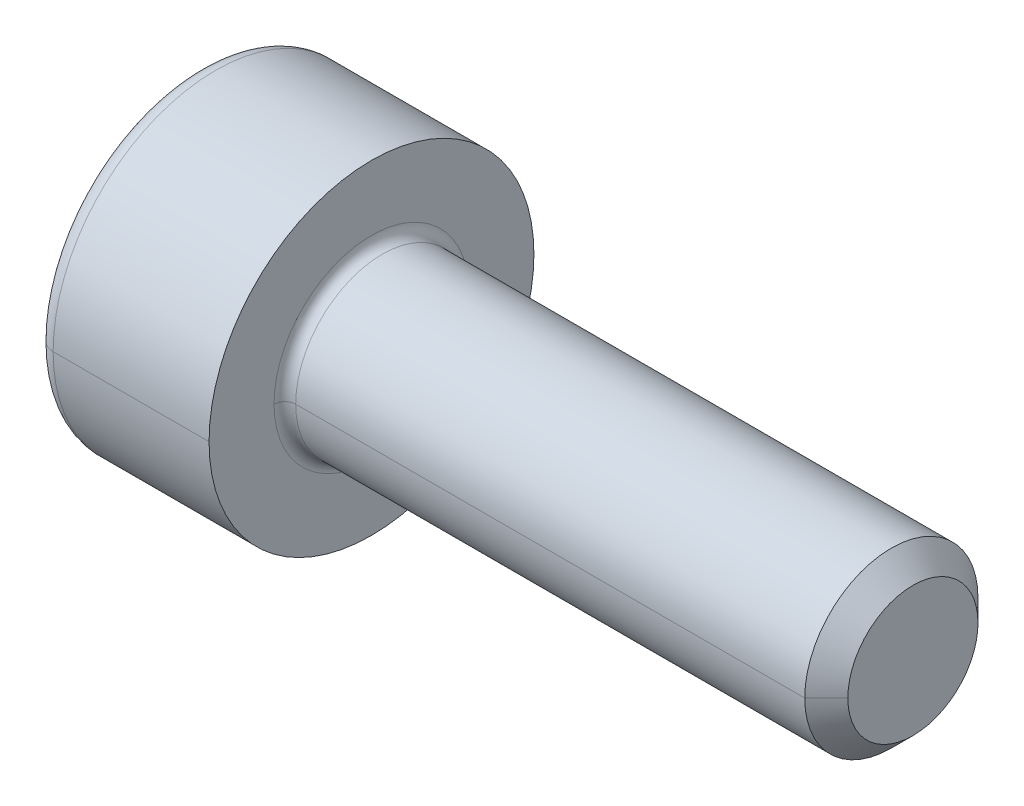
ISO-10303-21;
HEADER;
FILE_DESCRIPTION(('STEP AP214'),'2;1');
FILE_NAME('part.step','',(''),(''),'','','');
FILE_SCHEMA(('AUTOMOTIVE_DESIGN { 1 0 10303 214 1 1 1 1 }'));
ENDSEC;
DATA;
#1=APPLICATION_CONTEXT('core data for automotive mechanical design processes');
#2=APPLICATION_PROTOCOL_DEFINITION('international standard','automotive_design',2000,#1);
#3=PRODUCT_CONTEXT('',#1,'mechanical');
#4=PRODUCT('Part','Part','',(#3));
#5=PRODUCT_RELATED_PRODUCT_CATEGORY('part','',(#4));
#6=PRODUCT_DEFINITION_FORMATION('','',#4);
#7=PRODUCT_DEFINITION_CONTEXT('part definition',#1,'design');
#8=PRODUCT_DEFINITION('design','',#6,#7);
#9=PRODUCT_DEFINITION_SHAPE('','',#8);
#10=(LENGTH_UNIT() NAMED_UNIT(*) SI_UNIT(.MILLI.,.METRE.));
#11=(NAMED_UNIT(*) PLANE_ANGLE_UNIT() SI_UNIT($,.RADIAN.));
#12=(NAMED_UNIT(*) SI_UNIT($,.STERADIAN.) SOLID_ANGLE_UNIT());
#13=UNCERTAINTY_MEASURE_WITH_UNIT(LENGTH_MEASURE(1.E-05),#10,'distance_accuracy_value','');
#14=(GEOMETRIC_REPRESENTATION_CONTEXT(3) GLOBAL_UNCERTAINTY_ASSIGNED_CONTEXT((#13)) GLOBAL_UNIT_ASSIGNED_CONTEXT((#10,
#11,#12)) REPRESENTATION_CONTEXT('',''));
#15=CARTESIAN_POINT('',(0.,0.,0.));
#16=DIRECTION('',(0.,0.,1.));
#17=DIRECTION('',(1.,0.,0.));
#18=AXIS2_PLACEMENT_3D('',#15,#16,#17);
#19=CARTESIAN_POINT('',(0.7,0.,0.));
#20=DIRECTION('',(-1.,0.,0.));
#21=DIRECTION('',(0.,0.,1.));
#22=AXIS2_PLACEMENT_3D('',#19,#20,#21);
#23=CONICAL_SURFACE('',#22,0.76,1.0471975511966);
#24=DIRECTION('',(-0.5,0.,-0.866025403784438));
#25=VECTOR('',#24,1.);
#26=CARTESIAN_POINT('',(0.7,0.,-0.76));
#27=LINE('',#26,#25);
#28=CARTESIAN_POINT('',(1.13878620458412,0.,0.));
#29=VERTEX_POINT('',#28);
#30=CARTESIAN_POINT('',(0.7,0.,-0.76));
#31=VERTEX_POINT('',#30);
#32=EDGE_CURVE('E490',#29,#31,#27,.T.);
#33=ORIENTED_EDGE('',*,*,#32,.F.);
#34=DIRECTION('',(-0.5,0.,0.866025403784438));
#35=VECTOR('',#34,1.);
#36=CARTESIAN_POINT('',(0.7,0.,0.76));
#37=LINE('',#36,#35);
#38=CARTESIAN_POINT('',(0.7,0.,0.76));
#39=VERTEX_POINT('',#38);
#40=EDGE_CURVE('E494',#29,#39,#37,.T.);
#41=ORIENTED_EDGE('',*,*,#40,.T.);
#42=CARTESIAN_POINT('',(0.7,0.,0.));
#43=DIRECTION('',(-1.,0.,0.));
#44=DIRECTION('',(0.,0.,1.));
#45=AXIS2_PLACEMENT_3D('',#42,#43,#44);
#46=CIRCLE('',#45,0.76);
#47=CARTESIAN_POINT('',(0.7,0.658179306876174,0.38));
#48=VERTEX_POINT('',#47);
#49=EDGE_CURVE('E215',#39,#48,#46,.T.);
#50=ORIENTED_EDGE('',*,*,#49,.T.);
#51=CARTESIAN_POINT('',(0.7,0.,0.));
#52=DIRECTION('',(-1.,0.,0.));
#53=DIRECTION('',(0.,0.,1.));
#54=AXIS2_PLACEMENT_3D('',#51,#52,#53);
#55=CIRCLE('',#54,0.76);
#56=CARTESIAN_POINT('',(0.7,0.658179306876173,-0.38));
#57=VERTEX_POINT('',#56);
#58=EDGE_CURVE('E25',#48,#57,#55,.T.);
#59=ORIENTED_EDGE('',*,*,#58,.T.);
#60=CARTESIAN_POINT('',(0.7,0.,0.));
#61=DIRECTION('',(-1.,0.,0.));
#62=DIRECTION('',(0.,0.,1.));
#63=AXIS2_PLACEMENT_3D('',#60,#61,#62);
#64=CIRCLE('',#63,0.76);
#65=EDGE_CURVE('E10',#57,#31,#64,.T.);
#66=ORIENTED_EDGE('',*,*,#65,.T.);
#67=EDGE_LOOP('',(#33,#41,#50,#59,#66));
#68=FACE_BOUND('',#67,.T.);
#69=ADVANCED_FACE('F16',(#68),#23,.F.);
#70=CARTESIAN_POINT('',(0.7,1.31635861375234,-0.76));
#71=DIRECTION('',(1.,0.,0.));
#72=DIRECTION('',(0.,1.,0.));
#73=AXIS2_PLACEMENT_3D('',#70,#71,#72);
#74=PLANE('',#73);
#75=DIRECTION('',(0.,-0.5,-0.866025403784438));
#76=VECTOR('',#75,1.);
#77=CARTESIAN_POINT('',(0.7,0.877572409168231,0.));
#78=LINE('',#77,#76);
#79=CARTESIAN_POINT('',(0.7,0.438786204584114,-0.76));
#80=VERTEX_POINT('',#79);
#81=EDGE_CURVE('E46',#57,#80,#78,.T.);
#82=ORIENTED_EDGE('',*,*,#81,.T.);
#83=DIRECTION('',(0.,-1.,0.));
#84=VECTOR('',#83,1.);
#85=CARTESIAN_POINT('',(0.7,0.438786204584114,-0.76));
#86=LINE('',#85,#84);
#87=EDGE_CURVE('E208',#80,#31,#86,.T.);
#88=ORIENTED_EDGE('',*,*,#87,.T.);
#89=ORIENTED_EDGE('',*,*,#65,.F.);
#90=EDGE_LOOP('',(#82,#88,#89));
#91=FACE_BOUND('',#90,.T.);
#92=ADVANCED_FACE('F249',(#91),#74,.F.);
#93=CARTESIAN_POINT('',(0.7,1.31635861375234,-0.76));
#94=DIRECTION('',(1.,0.,0.));
#95=DIRECTION('',(0.,1.,0.));
#96=AXIS2_PLACEMENT_3D('',#93,#94,#95);
#97=PLANE('',#96);
#98=DIRECTION('',(0.,-0.5,0.86602540378444));
#99=VECTOR('',#98,1.);
#100=CARTESIAN_POINT('',(0.7,0.877572409168231,0.));
#101=LINE('',#100,#99);
#102=CARTESIAN_POINT('',(0.7,0.877572409168231,0.));
#103=VERTEX_POINT('',#102);
#104=EDGE_CURVE('E230',#103,#48,#101,.T.);
#105=ORIENTED_EDGE('',*,*,#104,.F.);
#106=DIRECTION('',(0.,-0.5,-0.866025403784438));
#107=VECTOR('',#106,1.);
#108=CARTESIAN_POINT('',(0.7,0.877572409168231,0.));
#109=LINE('',#108,#107);
#110=EDGE_CURVE('E214',#103,#57,#109,.T.);
#111=ORIENTED_EDGE('',*,*,#110,.T.);
#112=ORIENTED_EDGE('',*,*,#58,.F.);
#113=EDGE_LOOP('',(#105,#111,#112));
#114=FACE_BOUND('',#113,.T.);
#115=ADVANCED_FACE('F18',(#114),#97,.F.);
#116=CARTESIAN_POINT('',(0.7,1.31635861375234,-0.76));
#117=DIRECTION('',(1.,0.,0.));
#118=DIRECTION('',(0.,1.,0.));
#119=AXIS2_PLACEMENT_3D('',#116,#117,#118);
#120=PLANE('',#119);
#121=DIRECTION('',(0.,1.,0.));
#122=VECTOR('',#121,1.);
#123=CARTESIAN_POINT('',(0.7,-0.438786204584114,0.76));
#124=LINE('',#123,#122);
#125=CARTESIAN_POINT('',(0.7,0.438786204584117,0.76));
#126=VERTEX_POINT('',#125);
#127=EDGE_CURVE('E342',#39,#126,#124,.T.);
#128=ORIENTED_EDGE('',*,*,#127,.T.);
#129=DIRECTION('',(0.,-0.5,0.86602540378444));
#130=VECTOR('',#129,1.);
#131=CARTESIAN_POINT('',(0.7,0.877572409168231,0.));
#132=LINE('',#131,#130);
#133=EDGE_CURVE('E345',#48,#126,#132,.T.);
#134=ORIENTED_EDGE('',*,*,#133,.F.);
#135=ORIENTED_EDGE('',*,*,#49,.F.);
#136=EDGE_LOOP('',(#128,#134,#135));
#137=FACE_BOUND('',#136,.T.);
#138=ADVANCED_FACE('F257',(#137),#120,.F.);
#139=CARTESIAN_POINT('',(0.7,1.31635861375234,-0.76));
#140=DIRECTION('',(1.,0.,0.));
#141=DIRECTION('',(0.,1.,0.));
#142=AXIS2_PLACEMENT_3D('',#139,#140,#141);
#143=PLANE('',#142);
#144=DIRECTION('',(0.,-0.5,-0.866025403784438));
#145=VECTOR('',#144,1.);
#146=CARTESIAN_POINT('',(0.7,-0.438786204584114,0.76));
#147=LINE('',#146,#145);
#148=CARTESIAN_POINT('',(0.7,-0.438786204584114,0.76));
#149=VERTEX_POINT('',#148);
#150=CARTESIAN_POINT('',(0.7,-0.658179306876172,0.38));
#151=VERTEX_POINT('',#150);
#152=EDGE_CURVE('E190',#149,#151,#147,.T.);
#153=ORIENTED_EDGE('',*,*,#152,.F.);
#154=DIRECTION('',(0.,1.,0.));
#155=VECTOR('',#154,1.);
#156=CARTESIAN_POINT('',(0.7,-0.438786204584114,0.76));
#157=LINE('',#156,#155);
#158=EDGE_CURVE('E350',#149,#39,#157,.T.);
#159=ORIENTED_EDGE('',*,*,#158,.T.);
#160=CARTESIAN_POINT('',(0.7,0.,0.));
#161=DIRECTION('',(-1.,0.,0.));
#162=DIRECTION('',(0.,0.,1.));
#163=AXIS2_PLACEMENT_3D('',#160,#161,#162);
#164=CIRCLE('',#163,0.76);
#165=EDGE_CURVE('E500',#151,#39,#164,.T.);
#166=ORIENTED_EDGE('',*,*,#165,.F.);
#167=EDGE_LOOP('',(#153,#159,#166));
#168=FACE_BOUND('',#167,.T.);
#169=ADVANCED_FACE('F334',(#168),#143,.F.);
#170=CARTESIAN_POINT('',(0.7,1.31635861375234,-0.76));
#171=DIRECTION('',(1.,0.,0.));
#172=DIRECTION('',(0.,1.,0.));
#173=AXIS2_PLACEMENT_3D('',#170,#171,#172);
#174=PLANE('',#173);
#175=DIRECTION('',(0.,0.5,-0.86602540378444));
#176=VECTOR('',#175,1.);
#177=CARTESIAN_POINT('',(0.7,-0.87757240916823,0.));
#178=LINE('',#177,#176);
#179=CARTESIAN_POINT('',(0.7,-0.87757240916823,0.));
#180=VERTEX_POINT('',#179);
#181=CARTESIAN_POINT('',(0.7,-0.658179306876174,-0.38));
#182=VERTEX_POINT('',#181);
#183=EDGE_CURVE('E164',#180,#182,#178,.T.);
#184=ORIENTED_EDGE('',*,*,#183,.F.);
#185=DIRECTION('',(0.,-0.5,-0.866025403784438));
#186=VECTOR('',#185,1.);
#187=CARTESIAN_POINT('',(0.7,-0.438786204584114,0.76));
#188=LINE('',#187,#186);
#189=EDGE_CURVE('E168',#151,#180,#188,.T.);
#190=ORIENTED_EDGE('',*,*,#189,.F.);
#191=CARTESIAN_POINT('',(0.7,0.,0.));
#192=DIRECTION('',(-1.,0.,0.));
#193=DIRECTION('',(0.,0.,1.));
#194=AXIS2_PLACEMENT_3D('',#191,#192,#193);
#195=CIRCLE('',#194,0.76);
#196=EDGE_CURVE('E171',#182,#151,#195,.T.);
#197=ORIENTED_EDGE('',*,*,#196,.F.);
#198=EDGE_LOOP('',(#184,#190,#197));
#199=FACE_BOUND('',#198,.T.);
#200=ADVANCED_FACE('F166',(#199),#174,.F.);
#201=CARTESIAN_POINT('',(0.7,1.31635861375234,-0.76));
#202=DIRECTION('',(1.,0.,0.));
#203=DIRECTION('',(0.,1.,0.));
#204=AXIS2_PLACEMENT_3D('',#201,#202,#203);
#205=PLANE('',#204);
#206=DIRECTION('',(0.,-1.,0.));
#207=VECTOR('',#206,1.);
#208=CARTESIAN_POINT('',(0.7,0.438786204584114,-0.76));
#209=LINE('',#208,#207);
#210=CARTESIAN_POINT('',(0.7,-0.438786204584116,-0.76));
#211=VERTEX_POINT('',#210);
#212=EDGE_CURVE('E207',#31,#211,#209,.T.);
#213=ORIENTED_EDGE('',*,*,#212,.T.);
#214=DIRECTION('',(0.,0.5,-0.86602540378444));
#215=VECTOR('',#214,1.);
#216=CARTESIAN_POINT('',(0.7,-0.87757240916823,0.));
#217=LINE('',#216,#215);
#218=EDGE_CURVE('E176',#182,#211,#217,.T.);
#219=ORIENTED_EDGE('',*,*,#218,.F.);
#220=CARTESIAN_POINT('',(0.7,0.,0.));
#221=DIRECTION('',(-1.,0.,0.));
#222=DIRECTION('',(0.,0.,1.));
#223=AXIS2_PLACEMENT_3D('',#220,#221,#222);
#224=CIRCLE('',#223,0.76);
#225=EDGE_CURVE('E493',#31,#182,#224,.T.);
#226=ORIENTED_EDGE('',*,*,#225,.F.);
#227=EDGE_LOOP('',(#213,#219,#226));
#228=FACE_BOUND('',#227,.T.);
#229=ADVANCED_FACE('F328',(#228),#205,.F.);
#230=CARTESIAN_POINT('',(0.7,0.877572409168231,0.));
#231=DIRECTION('',(0.,0.866025403784438,-0.5));
#232=DIRECTION('',(-1.,0.,0.));
#233=AXIS2_PLACEMENT_3D('',#230,#231,#232);
#234=PLANE('',#233);
#235=DIRECTION('',(0.,-0.5,-0.866025403784438));
#236=VECTOR('',#235,1.);
#237=CARTESIAN_POINT('',(0.,0.877572409168231,0.));
#238=LINE('',#237,#236);
#239=CARTESIAN_POINT('',(0.,0.877572409168231,0.));
#240=VERTEX_POINT('',#239);
#241=CARTESIAN_POINT('',(0.,0.438786204584114,-0.76));
#242=VERTEX_POINT('',#241);
#243=EDGE_CURVE('E239',#240,#242,#238,.T.);
#244=ORIENTED_EDGE('',*,*,#243,.T.);
#245=DIRECTION('',(-1.,0.,0.));
#246=VECTOR('',#245,1.);
#247=CARTESIAN_POINT('',(0.7,0.438786204584114,-0.76));
#248=LINE('',#247,#246);
#249=EDGE_CURVE('E211',#80,#242,#248,.T.);
#250=ORIENTED_EDGE('',*,*,#249,.F.);
#251=ORIENTED_EDGE('',*,*,#81,.F.);
#252=ORIENTED_EDGE('',*,*,#110,.F.);
#253=DIRECTION('',(-1.,0.,0.));
#254=VECTOR('',#253,1.);
#255=CARTESIAN_POINT('',(0.7,0.877572409168231,0.));
#256=LINE('',#255,#254);
#257=EDGE_CURVE('E365',#103,#240,#256,.T.);
#258=ORIENTED_EDGE('',*,*,#257,.T.);
#259=EDGE_LOOP('',(#244,#250,#251,#252,#258));
#260=FACE_BOUND('',#259,.T.);
#261=ADVANCED_FACE('F236',(#260),#234,.F.);
#262=CARTESIAN_POINT('',(0.7,0.438786204584114,-0.76));
#263=DIRECTION('',(0.,0.,-1.));
#264=DIRECTION('',(0.,-1.,0.));
#265=AXIS2_PLACEMENT_3D('',#262,#263,#264);
#266=PLANE('',#265);
#267=DIRECTION('',(0.,-1.,0.));
#268=VECTOR('',#267,1.);
#269=CARTESIAN_POINT('',(0.,0.438786204584114,-0.76));
#270=LINE('',#269,#268);
#271=CARTESIAN_POINT('',(0.,-0.438786204584116,-0.76));
#272=VERTEX_POINT('',#271);
#273=EDGE_CURVE('E404',#242,#272,#270,.T.);
#274=ORIENTED_EDGE('',*,*,#273,.T.);
#275=DIRECTION('',(-1.,0.,0.));
#276=VECTOR('',#275,1.);
#277=CARTESIAN_POINT('',(0.7,-0.438786204584116,-0.76));
#278=LINE('',#277,#276);
#279=EDGE_CURVE('E204',#211,#272,#278,.T.);
#280=ORIENTED_EDGE('',*,*,#279,.F.);
#281=ORIENTED_EDGE('',*,*,#212,.F.);
#282=ORIENTED_EDGE('',*,*,#87,.F.);
#283=ORIENTED_EDGE('',*,*,#249,.T.);
#284=EDGE_LOOP('',(#274,#280,#281,#282,#283));
#285=FACE_BOUND('',#284,.T.);
#286=ADVANCED_FACE('F246',(#285),#266,.F.);
#287=CARTESIAN_POINT('',(0.7,-0.87757240916823,0.));
#288=DIRECTION('',(0.,0.86602540378444,0.5));
#289=DIRECTION('',(1.,0.,0.));
#290=AXIS2_PLACEMENT_3D('',#287,#288,#289);
#291=PLANE('',#290);
#292=DIRECTION('',(0.,0.5,-0.86602540378444));
#293=VECTOR('',#292,1.);
#294=CARTESIAN_POINT('',(0.,-0.87757240916823,0.));
#295=LINE('',#294,#293);
#296=CARTESIAN_POINT('',(0.,-0.87757240916823,0.));
#297=VERTEX_POINT('',#296);
#298=EDGE_CURVE('E182',#297,#272,#295,.T.);
#299=ORIENTED_EDGE('',*,*,#298,.F.);
#300=DIRECTION('',(-1.,0.,0.));
#301=VECTOR('',#300,1.);
#302=CARTESIAN_POINT('',(0.7,-0.87757240916823,0.));
#303=LINE('',#302,#301);
#304=EDGE_CURVE('E177',#180,#297,#303,.T.);
#305=ORIENTED_EDGE('',*,*,#304,.F.);
#306=ORIENTED_EDGE('',*,*,#183,.T.);
#307=ORIENTED_EDGE('',*,*,#218,.T.);
#308=ORIENTED_EDGE('',*,*,#279,.T.);
#309=EDGE_LOOP('',(#299,#305,#306,#307,#308));
#310=FACE_BOUND('',#309,.T.);
#311=ADVANCED_FACE('F180',(#310),#291,.T.);
#312=CARTESIAN_POINT('',(0.7,-0.438786204584114,0.76));
#313=DIRECTION('',(0.,0.866025403784438,-0.5));
#314=DIRECTION('',(-1.,0.,0.));
#315=AXIS2_PLACEMENT_3D('',#312,#313,#314);
#316=PLANE('',#315);
#317=DIRECTION('',(0.,-0.5,-0.866025403784438));
#318=VECTOR('',#317,1.);
#319=CARTESIAN_POINT('',(0.,-0.438786204584114,0.76));
#320=LINE('',#319,#318);
#321=CARTESIAN_POINT('',(0.,-0.438786204584114,0.76));
#322=VERTEX_POINT('',#321);
#323=EDGE_CURVE('E380',#322,#297,#320,.T.);
#324=ORIENTED_EDGE('',*,*,#323,.F.);
#325=DIRECTION('',(-1.,0.,0.));
#326=VECTOR('',#325,1.);
#327=CARTESIAN_POINT('',(0.7,-0.438786204584114,0.76));
#328=LINE('',#327,#326);
#329=EDGE_CURVE('E198',#149,#322,#328,.T.);
#330=ORIENTED_EDGE('',*,*,#329,.F.);
#331=ORIENTED_EDGE('',*,*,#152,.T.);
#332=ORIENTED_EDGE('',*,*,#189,.T.);
#333=ORIENTED_EDGE('',*,*,#304,.T.);
#334=EDGE_LOOP('',(#324,#330,#331,#332,#333));
#335=FACE_BOUND('',#334,.T.);
#336=ADVANCED_FACE('F188',(#335),#316,.T.);
#337=CARTESIAN_POINT('',(0.7,-0.438786204584114,0.76));
#338=DIRECTION('',(0.,0.,1.));
#339=DIRECTION('',(0.,-1.,0.));
#340=AXIS2_PLACEMENT_3D('',#337,#338,#339);
#341=PLANE('',#340);
#342=DIRECTION('',(0.,1.,0.));
#343=VECTOR('',#342,1.);
#344=CARTESIAN_POINT('',(0.,-0.438786204584114,0.76));
#345=LINE('',#344,#343);
#346=CARTESIAN_POINT('',(0.,0.438786204584117,0.76));
#347=VERTEX_POINT('',#346);
#348=EDGE_CURVE('E355',#322,#347,#345,.T.);
#349=ORIENTED_EDGE('',*,*,#348,.T.);
#350=DIRECTION('',(-1.,0.,0.));
#351=VECTOR('',#350,1.);
#352=CARTESIAN_POINT('',(0.7,0.438786204584117,0.76));
#353=LINE('',#352,#351);
#354=EDGE_CURVE('E351',#126,#347,#353,.T.);
#355=ORIENTED_EDGE('',*,*,#354,.F.);
#356=ORIENTED_EDGE('',*,*,#127,.F.);
#357=ORIENTED_EDGE('',*,*,#158,.F.);
#358=ORIENTED_EDGE('',*,*,#329,.T.);
#359=EDGE_LOOP('',(#349,#355,#356,#357,#358));
#360=FACE_BOUND('',#359,.T.);
#361=ADVANCED_FACE('F275',(#360),#341,.F.);
#362=CARTESIAN_POINT('',(0.7,0.877572409168231,0.));
#363=DIRECTION('',(0.,-0.86602540378444,-0.5));
#364=DIRECTION('',(0.,0.5,-0.86602540378444));
#365=AXIS2_PLACEMENT_3D('',#362,#363,#364);
#366=PLANE('',#365);
#367=DIRECTION('',(0.,-0.5,0.86602540378444));
#368=VECTOR('',#367,1.);
#369=CARTESIAN_POINT('',(0.,0.877572409168231,0.));
#370=LINE('',#369,#368);
#371=EDGE_CURVE('E384',#240,#347,#370,.T.);
#372=ORIENTED_EDGE('',*,*,#371,.F.);
#373=ORIENTED_EDGE('',*,*,#257,.F.);
#374=ORIENTED_EDGE('',*,*,#104,.T.);
#375=ORIENTED_EDGE('',*,*,#133,.T.);
#376=ORIENTED_EDGE('',*,*,#354,.T.);
#377=EDGE_LOOP('',(#372,#373,#374,#375,#376));
#378=FACE_BOUND('',#377,.T.);
#379=ADVANCED_FACE('F287',(#378),#366,.T.);
#380=CARTESIAN_POINT('',(0.16,0.,0.));
#381=DIRECTION('',(-1.,0.,0.));
#382=DIRECTION('',(0.,0.,1.));
#383=AXIS2_PLACEMENT_3D('',#380,#381,#382);
#384=TOROIDAL_SURFACE('',#383,1.34,0.16);
#385=CARTESIAN_POINT('',(0.16,0.,-1.34));
#386=DIRECTION('',(0.,1.,0.));
#387=DIRECTION('',(0.,0.,1.));
#388=AXIS2_PLACEMENT_3D('',#385,#386,#387);
#389=CIRCLE('',#388,0.16);
#390=CARTESIAN_POINT('',(0.16,0.,-1.5));
#391=VERTEX_POINT('',#390);
#392=CARTESIAN_POINT('',(0.,0.,-1.34));
#393=VERTEX_POINT('',#392);
#394=EDGE_CURVE('E507',#391,#393,#389,.T.);
#395=ORIENTED_EDGE('',*,*,#394,.F.);
#396=CARTESIAN_POINT('',(0.16,0.,0.));
#397=DIRECTION('',(1.,0.,0.));
#398=DIRECTION('',(0.,0.,1.));
#399=AXIS2_PLACEMENT_3D('',#396,#397,#398);
#400=CIRCLE('',#399,1.5);
#401=CARTESIAN_POINT('',(0.16,0.,1.5));
#402=VERTEX_POINT('',#401);
#403=EDGE_CURVE('E414',#402,#391,#400,.T.);
#404=ORIENTED_EDGE('',*,*,#403,.F.);
#405=CARTESIAN_POINT('',(0.16,0.,1.34));
#406=DIRECTION('',(0.,-1.,0.));
#407=DIRECTION('',(0.,0.,-1.));
#408=AXIS2_PLACEMENT_3D('',#405,#406,#407);
#409=CIRCLE('',#408,0.16);
#410=CARTESIAN_POINT('',(0.,0.,1.34));
#411=VERTEX_POINT('',#410);
#412=EDGE_CURVE('E460',#402,#411,#409,.T.);
#413=ORIENTED_EDGE('',*,*,#412,.T.);
#414=CARTESIAN_POINT('',(0.,0.,0.));
#415=DIRECTION('',(-1.,0.,0.));
#416=DIRECTION('',(0.,0.,1.));
#417=AXIS2_PLACEMENT_3D('',#414,#415,#416);
#418=CIRCLE('',#417,1.34);
#419=EDGE_CURVE('E390',#393,#411,#418,.T.);
#420=ORIENTED_EDGE('',*,*,#419,.F.);
#421=EDGE_LOOP('',(#395,#404,#413,#420));
#422=FACE_BOUND('',#421,.T.);
#423=ADVANCED_FACE('F283',(#422),#384,.T.);
#424=CARTESIAN_POINT('',(1.7,0.,0.));
#425=DIRECTION('',(1.,0.,0.));
#426=DIRECTION('',(0.,0.,-1.));
#427=AXIS2_PLACEMENT_3D('',#424,#425,#426);
#428=TOROIDAL_SURFACE('',#427,0.9,0.1);
#429=CARTESIAN_POINT('',(1.7,0.,0.9));
#430=DIRECTION('',(0.,1.,0.));
#431=DIRECTION('',(0.,0.,1.));
#432=AXIS2_PLACEMENT_3D('',#429,#430,#431);
#433=CIRCLE('',#432,0.1);
#434=CARTESIAN_POINT('',(1.7,0.,0.8));
#435=VERTEX_POINT('',#434);
#436=CARTESIAN_POINT('',(1.6,0.,0.9));
#437=VERTEX_POINT('',#436);
#438=EDGE_CURVE('E466',#435,#437,#433,.T.);
#439=ORIENTED_EDGE('',*,*,#438,.F.);
#440=CARTESIAN_POINT('',(1.7,0.,0.));
#441=DIRECTION('',(1.,0.,0.));
#442=DIRECTION('',(0.,0.,-1.));
#443=AXIS2_PLACEMENT_3D('',#440,#441,#442);
#444=CIRCLE('',#443,0.8);
#445=CARTESIAN_POINT('',(1.7,0.,-0.8));
#446=VERTEX_POINT('',#445);
#447=EDGE_CURVE('E439',#446,#435,#444,.T.);
#448=ORIENTED_EDGE('',*,*,#447,.F.);
#449=CARTESIAN_POINT('',(1.7,0.,-0.9));
#450=DIRECTION('',(0.,-1.,0.));
#451=DIRECTION('',(0.,0.,-1.));
#452=AXIS2_PLACEMENT_3D('',#449,#450,#451);
#453=CIRCLE('',#452,0.1);
#454=CARTESIAN_POINT('',(1.6,0.,-0.9));
#455=VERTEX_POINT('',#454);
#456=EDGE_CURVE('E473',#446,#455,#453,.T.);
#457=ORIENTED_EDGE('',*,*,#456,.T.);
#458=CARTESIAN_POINT('',(1.6,0.,0.));
#459=DIRECTION('',(-1.,0.,0.));
#460=DIRECTION('',(0.,0.,-1.));
#461=AXIS2_PLACEMENT_3D('',#458,#459,#460);
#462=CIRCLE('',#461,0.9);
#463=EDGE_CURVE('E416',#437,#455,#462,.T.);
#464=ORIENTED_EDGE('',*,*,#463,.F.);
#465=EDGE_LOOP('',(#439,#448,#457,#464));
#466=FACE_BOUND('',#465,.T.);
#467=ADVANCED_FACE('F286',(#466),#428,.F.);
#468=CARTESIAN_POINT('',(6.6,0.601,0.));
#469=DIRECTION('',(1.,0.,0.));
#470=DIRECTION('',(0.,1.,0.));
#471=AXIS2_PLACEMENT_3D('',#468,#469,#470);
#472=PLANE('',#471);
#473=CARTESIAN_POINT('',(6.6,0.,0.));
#474=DIRECTION('',(-1.,0.,0.));
#475=DIRECTION('',(0.,0.,1.));
#476=AXIS2_PLACEMENT_3D('',#473,#474,#475);
#477=CIRCLE('',#476,0.601);
#478=CARTESIAN_POINT('',(6.6,0.,0.601));
#479=VERTEX_POINT('',#478);
#480=CARTESIAN_POINT('',(6.6,0.,-0.601));
#481=VERTEX_POINT('',#480);
#482=EDGE_CURVE('E455',#479,#481,#477,.T.);
#483=ORIENTED_EDGE('',*,*,#482,.F.);
#484=CARTESIAN_POINT('',(6.6,0.,0.));
#485=DIRECTION('',(-1.,0.,0.));
#486=DIRECTION('',(0.,0.,1.));
#487=AXIS2_PLACEMENT_3D('',#484,#485,#486);
#488=CIRCLE('',#487,0.601);
#489=EDGE_CURVE('E371',#481,#479,#488,.T.);
#490=ORIENTED_EDGE('',*,*,#489,.F.);
#491=EDGE_LOOP('',(#483,#490));
#492=FACE_BOUND('',#491,.T.);
#493=ADVANCED_FACE('F317',(#492),#472,.T.);
#494=CARTESIAN_POINT('',(6.6,0.,0.));
#495=DIRECTION('',(-1.,0.,0.));
#496=DIRECTION('',(0.,0.,1.));
#497=AXIS2_PLACEMENT_3D('',#494,#495,#496);
#498=CONICAL_SURFACE('',#497,0.601,0.785398163397453);
#499=DIRECTION('',(-0.707106781186544,0.,-0.707106781186552));
#500=VECTOR('',#499,1.);
#501=CARTESIAN_POINT('',(6.6,0.,-0.601));
#502=LINE('',#501,#500);
#503=CARTESIAN_POINT('',(6.401,0.,-0.8));
#504=VERTEX_POINT('',#503);
#505=EDGE_CURVE('E449',#481,#504,#502,.T.);
#506=ORIENTED_EDGE('',*,*,#505,.F.);
#507=ORIENTED_EDGE('',*,*,#489,.T.);
#508=DIRECTION('',(-0.707106781186544,0.,0.707106781186552));
#509=VECTOR('',#508,1.);
#510=CARTESIAN_POINT('',(6.6,0.,0.601));
#511=LINE('',#510,#509);
#512=CARTESIAN_POINT('',(6.401,0.,0.8));
#513=VERTEX_POINT('',#512);
#514=EDGE_CURVE('E444',#479,#513,#511,.T.);
#515=ORIENTED_EDGE('',*,*,#514,.T.);
#516=CARTESIAN_POINT('',(6.401,0.,0.));
#517=DIRECTION('',(-1.,0.,0.));
#518=DIRECTION('',(0.,0.,1.));
#519=AXIS2_PLACEMENT_3D('',#516,#517,#518);
#520=CIRCLE('',#519,0.8);
#521=EDGE_CURVE('E369',#504,#513,#520,.T.);
#522=ORIENTED_EDGE('',*,*,#521,.F.);
#523=EDGE_LOOP('',(#506,#507,#515,#522));
#524=FACE_BOUND('',#523,.T.);
#525=ADVANCED_FACE('F313',(#524),#498,.T.);
#526=CARTESIAN_POINT('',(-31.75,0.,0.));
#527=DIRECTION('',(-1.,0.,0.));
#528=DIRECTION('',(0.,0.,1.));
#529=AXIS2_PLACEMENT_3D('',#526,#527,#528);
#530=CYLINDRICAL_SURFACE('',#529,0.8);
#531=DIRECTION('',(-1.,0.,0.));
#532=VECTOR('',#531,1.);
#533=CARTESIAN_POINT('',(-31.75,0.,-0.8));
#534=LINE('',#533,#532);
#535=EDGE_CURVE('E432',#504,#446,#534,.T.);
#536=ORIENTED_EDGE('',*,*,#535,.F.);
#537=ORIENTED_EDGE('',*,*,#521,.T.);
#538=DIRECTION('',(-1.,0.,0.));
#539=VECTOR('',#538,1.);
#540=CARTESIAN_POINT('',(-31.75,0.,0.8));
#541=LINE('',#540,#539);
#542=EDGE_CURVE('E429',#513,#435,#541,.T.);
#543=ORIENTED_EDGE('',*,*,#542,.T.);
#544=CARTESIAN_POINT('',(1.7,0.,0.));
#545=DIRECTION('',(1.,0.,0.));
#546=DIRECTION('',(0.,0.,-1.));
#547=AXIS2_PLACEMENT_3D('',#544,#545,#546);
#548=CIRCLE('',#547,0.8);
#549=EDGE_CURVE('E464',#435,#446,#548,.T.);
#550=ORIENTED_EDGE('',*,*,#549,.T.);
#551=EDGE_LOOP('',(#536,#537,#543,#550));
#552=FACE_BOUND('',#551,.T.);
#553=ADVANCED_FACE('F309',(#552),#530,.T.);
#554=CARTESIAN_POINT('',(1.6,1.5,0.));
#555=DIRECTION('',(1.,0.,0.));
#556=DIRECTION('',(0.,1.,0.));
#557=AXIS2_PLACEMENT_3D('',#554,#555,#556);
#558=PLANE('',#557);
#559=CARTESIAN_POINT('',(1.6,0.,0.));
#560=DIRECTION('',(-1.,0.,0.));
#561=DIRECTION('',(0.,0.,-1.));
#562=AXIS2_PLACEMENT_3D('',#559,#560,#561);
#563=CIRCLE('',#562,0.9);
#564=EDGE_CURVE('E470',#455,#437,#563,.T.);
#565=ORIENTED_EDGE('',*,*,#564,.T.);
#566=ORIENTED_EDGE('',*,*,#463,.T.);
#567=EDGE_LOOP('',(#565,#566));
#568=FACE_BOUND('',#567,.T.);
#569=CARTESIAN_POINT('',(1.6,0.,0.));
#570=DIRECTION('',(-1.,0.,0.));
#571=DIRECTION('',(0.,0.,1.));
#572=AXIS2_PLACEMENT_3D('',#569,#570,#571);
#573=CIRCLE('',#572,1.5);
#574=CARTESIAN_POINT('',(1.6,0.,1.5));
#575=VERTEX_POINT('',#574);
#576=CARTESIAN_POINT('',(1.6,0.,-1.5));
#577=VERTEX_POINT('',#576);
#578=EDGE_CURVE('E442',#575,#577,#573,.T.);
#579=ORIENTED_EDGE('',*,*,#578,.F.);
#580=CARTESIAN_POINT('',(1.6,0.,0.));
#581=DIRECTION('',(-1.,0.,0.));
#582=DIRECTION('',(0.,0.,1.));
#583=AXIS2_PLACEMENT_3D('',#580,#581,#582);
#584=CIRCLE('',#583,1.5);
#585=EDGE_CURVE('E407',#577,#575,#584,.T.);
#586=ORIENTED_EDGE('',*,*,#585,.F.);
#587=EDGE_LOOP('',(#579,#586));
#588=FACE_BOUND('',#587,.T.);
#589=ADVANCED_FACE('F305',(#568,#588),#558,.T.);
#590=CARTESIAN_POINT('',(-31.75,0.,0.));
#591=DIRECTION('',(-1.,0.,0.));
#592=DIRECTION('',(0.,0.,1.));
#593=AXIS2_PLACEMENT_3D('',#590,#591,#592);
#594=CYLINDRICAL_SURFACE('',#593,1.5);
#595=DIRECTION('',(-1.,0.,0.));
#596=VECTOR('',#595,1.);
#597=CARTESIAN_POINT('',(-31.75,0.,-1.5));
#598=LINE('',#597,#596);
#599=EDGE_CURVE('E394',#577,#391,#598,.T.);
#600=ORIENTED_EDGE('',*,*,#599,.F.);
#601=ORIENTED_EDGE('',*,*,#585,.T.);
#602=DIRECTION('',(-1.,0.,0.));
#603=VECTOR('',#602,1.);
#604=CARTESIAN_POINT('',(-31.75,0.,1.5));
#605=LINE('',#604,#603);
#606=EDGE_CURVE('E396',#575,#402,#605,.T.);
#607=ORIENTED_EDGE('',*,*,#606,.T.);
#608=ORIENTED_EDGE('',*,*,#403,.T.);
#609=EDGE_LOOP('',(#600,#601,#607,#608));
#610=FACE_BOUND('',#609,.T.);
#611=ADVANCED_FACE('F301',(#610),#594,.T.);
#612=CARTESIAN_POINT('',(0.,0.,0.));
#613=DIRECTION('',(-1.,0.,0.));
#614=DIRECTION('',(0.,0.,1.));
#615=AXIS2_PLACEMENT_3D('',#612,#613,#614);
#616=PLANE('',#615);
#617=ORIENTED_EDGE('',*,*,#371,.T.);
#618=ORIENTED_EDGE('',*,*,#348,.F.);
#619=ORIENTED_EDGE('',*,*,#323,.T.);
#620=ORIENTED_EDGE('',*,*,#298,.T.);
#621=ORIENTED_EDGE('',*,*,#273,.F.);
#622=ORIENTED_EDGE('',*,*,#243,.F.);
#623=EDGE_LOOP('',(#617,#618,#619,#620,#621,#622));
#624=FACE_BOUND('',#623,.T.);
#625=CARTESIAN_POINT('',(0.,0.,0.));
#626=DIRECTION('',(-1.,0.,0.));
#627=DIRECTION('',(0.,0.,1.));
#628=AXIS2_PLACEMENT_3D('',#625,#626,#627);
#629=CIRCLE('',#628,1.34);
#630=EDGE_CURVE('E465',#411,#393,#629,.T.);
#631=ORIENTED_EDGE('',*,*,#630,.T.);
#632=ORIENTED_EDGE('',*,*,#419,.T.);
#633=EDGE_LOOP('',(#631,#632));
#634=FACE_BOUND('',#633,.T.);
#635=ADVANCED_FACE('F291',(#624,#634),#616,.T.);
#636=CARTESIAN_POINT('',(-31.75,0.,0.));
#637=DIRECTION('',(-1.,0.,0.));
#638=DIRECTION('',(0.,0.,1.));
#639=AXIS2_PLACEMENT_3D('',#636,#637,#638);
#640=CYLINDRICAL_SURFACE('',#639,1.5);
#641=ORIENTED_EDGE('',*,*,#578,.T.);
#642=ORIENTED_EDGE('',*,*,#599,.T.);
#643=CARTESIAN_POINT('',(0.16,0.,0.));
#644=DIRECTION('',(1.,0.,0.));
#645=DIRECTION('',(0.,0.,1.));
#646=AXIS2_PLACEMENT_3D('',#643,#644,#645);
#647=CIRCLE('',#646,1.5);
#648=EDGE_CURVE('E502',#391,#402,#647,.T.);
#649=ORIENTED_EDGE('',*,*,#648,.T.);
#650=ORIENTED_EDGE('',*,*,#606,.F.);
#651=EDGE_LOOP('',(#641,#642,#649,#650));
#652=FACE_BOUND('',#651,.T.);
#653=ADVANCED_FACE('F281',(#652),#640,.T.);
#654=CARTESIAN_POINT('',(-31.75,0.,0.));
#655=DIRECTION('',(-1.,0.,0.));
#656=DIRECTION('',(0.,0.,1.));
#657=AXIS2_PLACEMENT_3D('',#654,#655,#656);
#658=CYLINDRICAL_SURFACE('',#657,0.8);
#659=CARTESIAN_POINT('',(6.401,0.,0.));
#660=DIRECTION('',(-1.,0.,0.));
#661=DIRECTION('',(0.,0.,1.));
#662=AXIS2_PLACEMENT_3D('',#659,#660,#661);
#663=CIRCLE('',#662,0.8);
#664=EDGE_CURVE('E437',#513,#504,#663,.T.);
#665=ORIENTED_EDGE('',*,*,#664,.T.);
#666=ORIENTED_EDGE('',*,*,#535,.T.);
#667=ORIENTED_EDGE('',*,*,#447,.T.);
#668=ORIENTED_EDGE('',*,*,#542,.F.);
#669=EDGE_LOOP('',(#665,#666,#667,#668));
#670=FACE_BOUND('',#669,.T.);
#671=ADVANCED_FACE('F271',(#670),#658,.T.);
#672=CARTESIAN_POINT('',(6.6,0.,0.));
#673=DIRECTION('',(-1.,0.,0.));
#674=DIRECTION('',(0.,0.,1.));
#675=AXIS2_PLACEMENT_3D('',#672,#673,#674);
#676=CONICAL_SURFACE('',#675,0.601,0.785398163397453);
#677=ORIENTED_EDGE('',*,*,#482,.T.);
#678=ORIENTED_EDGE('',*,*,#505,.T.);
#679=ORIENTED_EDGE('',*,*,#664,.F.);
#680=ORIENTED_EDGE('',*,*,#514,.F.);
#681=EDGE_LOOP('',(#677,#678,#679,#680));
#682=FACE_BOUND('',#681,.T.);
#683=ADVANCED_FACE('F268',(#682),#676,.T.);
#684=CARTESIAN_POINT('',(1.7,0.,0.));
#685=DIRECTION('',(1.,0.,0.));
#686=DIRECTION('',(0.,0.,-1.));
#687=AXIS2_PLACEMENT_3D('',#684,#685,#686);
#688=TOROIDAL_SURFACE('',#687,0.9,0.1);
#689=ORIENTED_EDGE('',*,*,#549,.F.);
#690=ORIENTED_EDGE('',*,*,#438,.T.);
#691=ORIENTED_EDGE('',*,*,#564,.F.);
#692=ORIENTED_EDGE('',*,*,#456,.F.);
#693=EDGE_LOOP('',(#689,#690,#691,#692));
#694=FACE_BOUND('',#693,.T.);
#695=ADVANCED_FACE('F261',(#694),#688,.F.);
#696=CARTESIAN_POINT('',(0.16,0.,0.));
#697=DIRECTION('',(-1.,0.,0.));
#698=DIRECTION('',(0.,0.,1.));
#699=AXIS2_PLACEMENT_3D('',#696,#697,#698);
#700=TOROIDAL_SURFACE('',#699,1.34,0.16);
#701=ORIENTED_EDGE('',*,*,#648,.F.);
#702=ORIENTED_EDGE('',*,*,#394,.T.);
#703=ORIENTED_EDGE('',*,*,#630,.F.);
#704=ORIENTED_EDGE('',*,*,#412,.F.);
#705=EDGE_LOOP('',(#701,#702,#703,#704));
#706=FACE_BOUND('',#705,.T.);
#707=ADVANCED_FACE('F266',(#706),#700,.T.);
#708=CARTESIAN_POINT('',(0.7,0.,0.));
#709=DIRECTION('',(-1.,0.,0.));
#710=DIRECTION('',(0.,0.,1.));
#711=AXIS2_PLACEMENT_3D('',#708,#709,#710);
#712=CONICAL_SURFACE('',#711,0.76,1.0471975511966);
#713=ORIENTED_EDGE('',*,*,#40,.F.);
#714=ORIENTED_EDGE('',*,*,#32,.T.);
#715=ORIENTED_EDGE('',*,*,#225,.T.);
#716=ORIENTED_EDGE('',*,*,#196,.T.);
#717=ORIENTED_EDGE('',*,*,#165,.T.);
#718=EDGE_LOOP('',(#713,#714,#715,#716,#717));
#719=FACE_BOUND('',#718,.T.);
#720=ADVANCED_FACE('F263',(#719),#712,.F.);
#721=CLOSED_SHELL('',(#69,#92,#115,#138,#169,#200,#229,#261,#286,#311,#336,#361,#379,#423,#467,
#493,#525,#553,#589,#611,#635,#653,#671,#683,#695,#707,#720));
#722=MANIFOLD_SOLID_BREP('B1',#721);
#723=ADVANCED_BREP_SHAPE_REPRESENTATION('',(#18,#722),#14);
#724=SHAPE_DEFINITION_REPRESENTATION(#9,#723);
ENDSEC;
END-ISO-10303-21;
